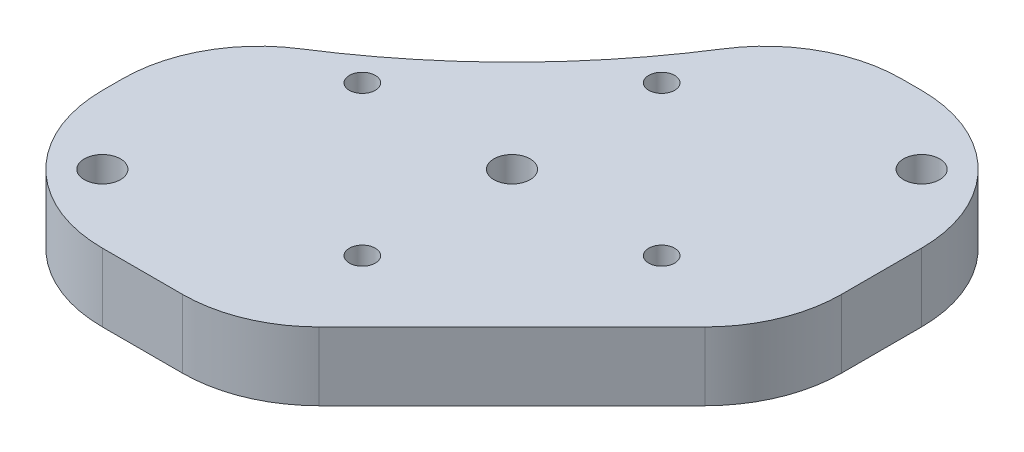
ISO-10303-21;
HEADER;
FILE_DESCRIPTION(('STEP AP214'),'2;1');
FILE_NAME('part.step','',(''),(''),'','','');
FILE_SCHEMA(('AUTOMOTIVE_DESIGN { 1 0 10303 214 1 1 1 1 }'));
ENDSEC;
DATA;
#1=APPLICATION_CONTEXT('core data for automotive mechanical design processes');
#2=APPLICATION_PROTOCOL_DEFINITION('international standard','automotive_design',2000,#1);
#3=PRODUCT_CONTEXT('',#1,'mechanical');
#4=PRODUCT('Part','Part','',(#3));
#5=PRODUCT_RELATED_PRODUCT_CATEGORY('part','',(#4));
#6=PRODUCT_DEFINITION_FORMATION('','',#4);
#7=PRODUCT_DEFINITION_CONTEXT('part definition',#1,'design');
#8=PRODUCT_DEFINITION('design','',#6,#7);
#9=PRODUCT_DEFINITION_SHAPE('','',#8);
#10=(LENGTH_UNIT() NAMED_UNIT(*) SI_UNIT(.MILLI.,.METRE.));
#11=(NAMED_UNIT(*) PLANE_ANGLE_UNIT() SI_UNIT($,.RADIAN.));
#12=(NAMED_UNIT(*) SI_UNIT($,.STERADIAN.) SOLID_ANGLE_UNIT());
#13=UNCERTAINTY_MEASURE_WITH_UNIT(LENGTH_MEASURE(1.E-05),#10,'distance_accuracy_value','');
#14=(GEOMETRIC_REPRESENTATION_CONTEXT(3) GLOBAL_UNCERTAINTY_ASSIGNED_CONTEXT((#13)) GLOBAL_UNIT_ASSIGNED_CONTEXT((#10,
#11,#12)) REPRESENTATION_CONTEXT('',''));
#15=CARTESIAN_POINT('',(0.,0.,0.));
#16=DIRECTION('',(0.,0.,1.));
#17=DIRECTION('',(1.,0.,0.));
#18=AXIS2_PLACEMENT_3D('',#15,#16,#17);
#19=CARTESIAN_POINT('',(105.000000000024,10.,105.000000000024));
#20=DIRECTION('',(-0.707106781186548,0.,-0.707106781186547));
#21=DIRECTION('',(-0.707106781186547,0.,0.707106781186548));
#22=AXIS2_PLACEMENT_3D('',#19,#20,#21);
#23=PLANE('',#22);
#24=DIRECTION('',(0.707106781186547,0.,-0.707106781186548));
#25=VECTOR('',#24,1.);
#26=CARTESIAN_POINT('',(105.000000000024,0.,105.000000000024));
#27=LINE('',#26,#25);
#28=CARTESIAN_POINT('',(90.8578643763174,0.,119.142135623731));
#29=VERTEX_POINT('',#28);
#30=CARTESIAN_POINT('',(119.142135623731,0.,90.8578643763174));
#31=VERTEX_POINT('',#30);
#32=EDGE_CURVE('E266',#29,#31,#27,.T.);
#33=ORIENTED_EDGE('',*,*,#32,.T.);
#34=DIRECTION('',(0.,-1.,0.));
#35=VECTOR('',#34,1.);
#36=CARTESIAN_POINT('',(119.142135623731,10.,90.8578643763174));
#37=LINE('',#36,#35);
#38=CARTESIAN_POINT('',(119.142135623731,10.,90.8578643763174));
#39=VERTEX_POINT('',#38);
#40=EDGE_CURVE('E229',#31,#39,#37,.F.);
#41=ORIENTED_EDGE('',*,*,#40,.T.);
#42=DIRECTION('',(0.707106781186547,0.,-0.707106781186548));
#43=VECTOR('',#42,1.);
#44=CARTESIAN_POINT('',(105.000000000024,10.,105.000000000024));
#45=LINE('',#44,#43);
#46=CARTESIAN_POINT('',(90.8578643763174,10.,119.142135623731));
#47=VERTEX_POINT('',#46);
#48=EDGE_CURVE('E310',#47,#39,#45,.T.);
#49=ORIENTED_EDGE('',*,*,#48,.F.);
#50=DIRECTION('',(0.,-1.,0.));
#51=VECTOR('',#50,1.);
#52=CARTESIAN_POINT('',(90.8578643763174,10.,119.142135623731));
#53=LINE('',#52,#51);
#54=EDGE_CURVE('E225',#47,#29,#53,.T.);
#55=ORIENTED_EDGE('',*,*,#54,.T.);
#56=EDGE_LOOP('',(#33,#41,#49,#55));
#57=FACE_BOUND('',#56,.T.);
#58=ADVANCED_FACE('F47',(#57),#23,.F.);
#59=CARTESIAN_POINT('',(125.,10.,0.));
#60=DIRECTION('',(-1.,0.,0.));
#61=DIRECTION('',(0.,0.,1.));
#62=AXIS2_PLACEMENT_3D('',#59,#60,#61);
#63=PLANE('',#62);
#64=DIRECTION('',(0.,0.,-1.));
#65=VECTOR('',#64,1.);
#66=CARTESIAN_POINT('',(125.,0.,0.));
#67=LINE('',#66,#65);
#68=CARTESIAN_POINT('',(125.,0.,76.7157287525864));
#69=VERTEX_POINT('',#68);
#70=CARTESIAN_POINT('',(125.,0.,65.));
#71=VERTEX_POINT('',#70);
#72=EDGE_CURVE('E270',#69,#71,#67,.T.);
#73=ORIENTED_EDGE('',*,*,#72,.T.);
#74=DIRECTION('',(0.,-1.,0.));
#75=VECTOR('',#74,1.);
#76=CARTESIAN_POINT('',(125.,10.,65.));
#77=LINE('',#76,#75);
#78=CARTESIAN_POINT('',(125.,10.,65.));
#79=VERTEX_POINT('',#78);
#80=EDGE_CURVE('E222',#71,#79,#77,.F.);
#81=ORIENTED_EDGE('',*,*,#80,.T.);
#82=DIRECTION('',(0.,0.,-1.));
#83=VECTOR('',#82,1.);
#84=CARTESIAN_POINT('',(125.,10.,0.));
#85=LINE('',#84,#83);
#86=CARTESIAN_POINT('',(125.,10.,76.7157287525864));
#87=VERTEX_POINT('',#86);
#88=EDGE_CURVE('E316',#87,#79,#85,.T.);
#89=ORIENTED_EDGE('',*,*,#88,.F.);
#90=DIRECTION('',(0.,-1.,0.));
#91=VECTOR('',#90,1.);
#92=CARTESIAN_POINT('',(125.,10.,76.7157287525864));
#93=LINE('',#92,#91);
#94=EDGE_CURVE('E218',#87,#69,#93,.T.);
#95=ORIENTED_EDGE('',*,*,#94,.T.);
#96=EDGE_LOOP('',(#73,#81,#89,#95));
#97=FACE_BOUND('',#96,.T.);
#98=ADVANCED_FACE('F349',(#97),#63,.F.);
#99=CARTESIAN_POINT('',(0.,10.,45.));
#100=DIRECTION('',(0.,0.,-1.));
#101=DIRECTION('',(-1.,0.,0.));
#102=AXIS2_PLACEMENT_3D('',#99,#100,#101);
#103=PLANE('',#102);
#104=DIRECTION('',(1.,0.,0.));
#105=VECTOR('',#104,1.);
#106=CARTESIAN_POINT('',(0.,0.,45.));
#107=LINE('',#106,#105);
#108=CARTESIAN_POINT('',(102.058806577385,0.,45.));
#109=VERTEX_POINT('',#108);
#110=CARTESIAN_POINT('',(105.,0.,45.));
#111=VERTEX_POINT('',#110);
#112=EDGE_CURVE('E274',#109,#111,#107,.T.);
#113=ORIENTED_EDGE('',*,*,#112,.F.);
#114=DIRECTION('',(0.,-1.,0.));
#115=VECTOR('',#114,1.);
#116=CARTESIAN_POINT('',(102.058806577385,10.,45.));
#117=LINE('',#116,#115);
#118=CARTESIAN_POINT('',(102.058806577385,10.,45.));
#119=VERTEX_POINT('',#118);
#120=EDGE_CURVE('E215',#109,#119,#117,.F.);
#121=ORIENTED_EDGE('',*,*,#120,.T.);
#122=DIRECTION('',(1.,0.,0.));
#123=VECTOR('',#122,1.);
#124=CARTESIAN_POINT('',(0.,10.,45.));
#125=LINE('',#124,#123);
#126=CARTESIAN_POINT('',(105.,10.,45.));
#127=VERTEX_POINT('',#126);
#128=EDGE_CURVE('E322',#119,#127,#125,.T.);
#129=ORIENTED_EDGE('',*,*,#128,.T.);
#130=DIRECTION('',(0.,-1.,0.));
#131=VECTOR('',#130,1.);
#132=CARTESIAN_POINT('',(105.,0.,45.));
#133=LINE('',#132,#131);
#134=EDGE_CURVE('E211',#127,#111,#133,.T.);
#135=ORIENTED_EDGE('',*,*,#134,.T.);
#136=EDGE_LOOP('',(#113,#121,#129,#135));
#137=FACE_BOUND('',#136,.T.);
#138=ADVANCED_FACE('F340',(#137),#103,.T.);
#139=CARTESIAN_POINT('',(0.,10.,0.));
#140=DIRECTION('',(0.,-1.,0.));
#141=DIRECTION('',(0.,0.,-1.));
#142=AXIS2_PLACEMENT_3D('',#139,#140,#141);
#143=CYLINDRICAL_SURFACE('',#142,101.);
#144=CARTESIAN_POINT('',(0.,0.,0.));
#145=DIRECTION('',(0.,1.,0.));
#146=DIRECTION('',(0.,0.,1.));
#147=AXIS2_PLACEMENT_3D('',#144,#145,#146);
#148=CIRCLE('',#147,101.);
#149=CARTESIAN_POINT('',(54.2561983471074,0.,85.1895823497177));
#150=VERTEX_POINT('',#149);
#151=CARTESIAN_POINT('',(85.1895823497177,0.,54.2561983471074));
#152=VERTEX_POINT('',#151);
#153=EDGE_CURVE('E158',#150,#152,#148,.T.);
#154=ORIENTED_EDGE('',*,*,#153,.F.);
#155=DIRECTION('',(0.,-1.,0.));
#156=VECTOR('',#155,1.);
#157=CARTESIAN_POINT('',(54.2561983471074,10.,85.1895823497177));
#158=LINE('',#157,#156);
#159=CARTESIAN_POINT('',(54.2561983471074,10.,85.1895823497177));
#160=VERTEX_POINT('',#159);
#161=EDGE_CURVE('E191',#150,#160,#158,.F.);
#162=ORIENTED_EDGE('',*,*,#161,.T.);
#163=CARTESIAN_POINT('',(0.,10.,0.));
#164=DIRECTION('',(0.,1.,0.));
#165=DIRECTION('',(0.,0.,1.));
#166=AXIS2_PLACEMENT_3D('',#163,#164,#165);
#167=CIRCLE('',#166,101.);
#168=CARTESIAN_POINT('',(85.1895823497177,10.,54.2561983471074));
#169=VERTEX_POINT('',#168);
#170=EDGE_CURVE('E244',#160,#169,#167,.T.);
#171=ORIENTED_EDGE('',*,*,#170,.T.);
#172=DIRECTION('',(0.,-1.,0.));
#173=VECTOR('',#172,1.);
#174=CARTESIAN_POINT('',(85.1895823497177,10.,54.2561983471074));
#175=LINE('',#174,#173);
#176=EDGE_CURVE('E187',#169,#152,#175,.T.);
#177=ORIENTED_EDGE('',*,*,#176,.T.);
#178=EDGE_LOOP('',(#154,#162,#171,#177));
#179=FACE_BOUND('',#178,.T.);
#180=ADVANCED_FACE('F331',(#179),#143,.F.);
#181=CARTESIAN_POINT('',(45.,10.,0.));
#182=DIRECTION('',(-1.,0.,0.));
#183=DIRECTION('',(0.,0.,1.));
#184=AXIS2_PLACEMENT_3D('',#181,#182,#183);
#185=PLANE('',#184);
#186=DIRECTION('',(0.,0.,-1.));
#187=VECTOR('',#186,1.);
#188=CARTESIAN_POINT('',(45.,10.,0.));
#189=LINE('',#188,#187);
#190=CARTESIAN_POINT('',(45.,10.,105.));
#191=VERTEX_POINT('',#190);
#192=CARTESIAN_POINT('',(45.,10.,102.058806577385));
#193=VERTEX_POINT('',#192);
#194=EDGE_CURVE('E237',#191,#193,#189,.T.);
#195=ORIENTED_EDGE('',*,*,#194,.T.);
#196=DIRECTION('',(0.,-1.,0.));
#197=VECTOR('',#196,1.);
#198=CARTESIAN_POINT('',(45.,10.,102.058806577385));
#199=LINE('',#198,#197);
#200=CARTESIAN_POINT('',(45.,0.,102.058806577385));
#201=VERTEX_POINT('',#200);
#202=EDGE_CURVE('E149',#193,#201,#199,.T.);
#203=ORIENTED_EDGE('',*,*,#202,.T.);
#204=DIRECTION('',(0.,0.,-1.));
#205=VECTOR('',#204,1.);
#206=CARTESIAN_POINT('',(45.,0.,0.));
#207=LINE('',#206,#205);
#208=CARTESIAN_POINT('',(45.,0.,105.));
#209=VERTEX_POINT('',#208);
#210=EDGE_CURVE('E141',#209,#201,#207,.T.);
#211=ORIENTED_EDGE('',*,*,#210,.F.);
#212=DIRECTION('',(0.,-1.,0.));
#213=VECTOR('',#212,1.);
#214=CARTESIAN_POINT('',(45.,10.,105.));
#215=LINE('',#214,#213);
#216=EDGE_CURVE('E155',#209,#191,#215,.F.);
#217=ORIENTED_EDGE('',*,*,#216,.T.);
#218=EDGE_LOOP('',(#195,#203,#211,#217));
#219=FACE_BOUND('',#218,.T.);
#220=ADVANCED_FACE('F154',(#219),#185,.T.);
#221=CARTESIAN_POINT('',(115.,10.,55.0000000000002));
#222=DIRECTION('',(0.,-1.,0.));
#223=DIRECTION('',(0.,0.,-1.));
#224=AXIS2_PLACEMENT_3D('',#221,#222,#223);
#225=CYLINDRICAL_SURFACE('',#224,2.65);
#226=CARTESIAN_POINT('',(115.,10.,55.0000000000002));
#227=DIRECTION('',(0.,1.,0.));
#228=DIRECTION('',(0.,0.,1.));
#229=AXIS2_PLACEMENT_3D('',#226,#227,#228);
#230=CIRCLE('',#229,2.65);
#231=CARTESIAN_POINT('',(115.,10.,57.6500000000002));
#232=VERTEX_POINT('',#231);
#233=EDGE_CURVE('E167',#232,#232,#230,.T.);
#234=ORIENTED_EDGE('',*,*,#233,.T.);
#235=EDGE_LOOP('',(#234));
#236=FACE_BOUND('',#235,.T.);
#237=CARTESIAN_POINT('',(115.,0.,55.0000000000002));
#238=DIRECTION('',(0.,1.,0.));
#239=DIRECTION('',(0.,0.,1.));
#240=AXIS2_PLACEMENT_3D('',#237,#238,#239);
#241=CIRCLE('',#240,2.65);
#242=CARTESIAN_POINT('',(115.,0.,57.6500000000002));
#243=VERTEX_POINT('',#242);
#244=EDGE_CURVE('E298',#243,#243,#241,.T.);
#245=ORIENTED_EDGE('',*,*,#244,.F.);
#246=EDGE_LOOP('',(#245));
#247=FACE_BOUND('',#246,.T.);
#248=ADVANCED_FACE('F475',(#236,#247),#225,.F.);
#249=CARTESIAN_POINT('',(63.0796897832173,10.,85.0000000000001));
#250=DIRECTION('',(0.,-1.,0.));
#251=DIRECTION('',(0.,0.,-1.));
#252=AXIS2_PLACEMENT_3D('',#249,#250,#251);
#253=CYLINDRICAL_SURFACE('',#252,1.90000000000001);
#254=CARTESIAN_POINT('',(63.0796897832173,10.,85.0000000000001));
#255=DIRECTION('',(0.,1.,0.));
#256=DIRECTION('',(0.,0.,1.));
#257=AXIS2_PLACEMENT_3D('',#254,#255,#256);
#258=CIRCLE('',#257,1.90000000000001);
#259=CARTESIAN_POINT('',(63.0796897832173,10.,86.9000000000001));
#260=VERTEX_POINT('',#259);
#261=EDGE_CURVE('E255',#260,#260,#258,.T.);
#262=ORIENTED_EDGE('',*,*,#261,.T.);
#263=EDGE_LOOP('',(#262));
#264=FACE_BOUND('',#263,.T.);
#265=CARTESIAN_POINT('',(63.0796897832173,0.,85.0000000000001));
#266=DIRECTION('',(0.,1.,0.));
#267=DIRECTION('',(0.,0.,1.));
#268=AXIS2_PLACEMENT_3D('',#265,#266,#267);
#269=CIRCLE('',#268,1.90000000000001);
#270=CARTESIAN_POINT('',(63.0796897832173,0.,86.9000000000001));
#271=VERTEX_POINT('',#270);
#272=EDGE_CURVE('E295',#271,#271,#269,.T.);
#273=ORIENTED_EDGE('',*,*,#272,.F.);
#274=EDGE_LOOP('',(#273));
#275=FACE_BOUND('',#274,.T.);
#276=ADVANCED_FACE('F513',(#264,#275),#253,.F.);
#277=CARTESIAN_POINT('',(85.,10.,63.079689783217));
#278=DIRECTION('',(0.,-1.,0.));
#279=DIRECTION('',(0.,0.,-1.));
#280=AXIS2_PLACEMENT_3D('',#277,#278,#279);
#281=CYLINDRICAL_SURFACE('',#280,1.9);
#282=CARTESIAN_POINT('',(85.,10.,63.079689783217));
#283=DIRECTION('',(0.,1.,0.));
#284=DIRECTION('',(0.,0.,1.));
#285=AXIS2_PLACEMENT_3D('',#282,#283,#284);
#286=CIRCLE('',#285,1.9);
#287=CARTESIAN_POINT('',(85.,10.,64.979689783217));
#288=VERTEX_POINT('',#287);
#289=EDGE_CURVE('E251',#288,#288,#286,.T.);
#290=ORIENTED_EDGE('',*,*,#289,.T.);
#291=EDGE_LOOP('',(#290));
#292=FACE_BOUND('',#291,.T.);
#293=CARTESIAN_POINT('',(85.,0.,63.079689783217));
#294=DIRECTION('',(0.,1.,0.));
#295=DIRECTION('',(0.,0.,1.));
#296=AXIS2_PLACEMENT_3D('',#293,#294,#295);
#297=CIRCLE('',#296,1.9);
#298=CARTESIAN_POINT('',(85.,0.,64.979689783217));
#299=VERTEX_POINT('',#298);
#300=EDGE_CURVE('E291',#299,#299,#297,.T.);
#301=ORIENTED_EDGE('',*,*,#300,.F.);
#302=EDGE_LOOP('',(#301));
#303=FACE_BOUND('',#302,.T.);
#304=ADVANCED_FACE('F521',(#292,#303),#281,.F.);
#305=CARTESIAN_POINT('',(85.0000000000005,10.,106.920310216783));
#306=DIRECTION('',(0.,-1.,0.));
#307=DIRECTION('',(0.,0.,-1.));
#308=AXIS2_PLACEMENT_3D('',#305,#306,#307);
#309=CYLINDRICAL_SURFACE('',#308,1.90000000000001);
#310=CARTESIAN_POINT('',(85.0000000000005,10.,106.920310216783));
#311=DIRECTION('',(0.,1.,0.));
#312=DIRECTION('',(0.,0.,1.));
#313=AXIS2_PLACEMENT_3D('',#310,#311,#312);
#314=CIRCLE('',#313,1.90000000000001);
#315=CARTESIAN_POINT('',(85.0000000000005,10.,108.820310216783));
#316=VERTEX_POINT('',#315);
#317=EDGE_CURVE('E242',#316,#316,#314,.T.);
#318=ORIENTED_EDGE('',*,*,#317,.T.);
#319=EDGE_LOOP('',(#318));
#320=FACE_BOUND('',#319,.T.);
#321=CARTESIAN_POINT('',(85.0000000000005,0.,106.920310216783));
#322=DIRECTION('',(0.,1.,0.));
#323=DIRECTION('',(0.,0.,1.));
#324=AXIS2_PLACEMENT_3D('',#321,#322,#323);
#325=CIRCLE('',#324,1.90000000000001);
#326=CARTESIAN_POINT('',(85.0000000000005,0.,108.820310216783));
#327=VERTEX_POINT('',#326);
#328=EDGE_CURVE('E287',#327,#327,#325,.T.);
#329=ORIENTED_EDGE('',*,*,#328,.F.);
#330=EDGE_LOOP('',(#329));
#331=FACE_BOUND('',#330,.T.);
#332=ADVANCED_FACE('F530',(#320,#331),#309,.F.);
#333=CARTESIAN_POINT('',(55.,10.,115.));
#334=DIRECTION('',(0.,-1.,0.));
#335=DIRECTION('',(0.,0.,-1.));
#336=AXIS2_PLACEMENT_3D('',#333,#334,#335);
#337=CYLINDRICAL_SURFACE('',#336,2.65);
#338=CARTESIAN_POINT('',(55.,10.,115.));
#339=DIRECTION('',(0.,1.,0.));
#340=DIRECTION('',(0.,0.,1.));
#341=AXIS2_PLACEMENT_3D('',#338,#339,#340);
#342=CIRCLE('',#341,2.65);
#343=CARTESIAN_POINT('',(55.,10.,117.65));
#344=VERTEX_POINT('',#343);
#345=EDGE_CURVE('E236',#344,#344,#342,.T.);
#346=ORIENTED_EDGE('',*,*,#345,.T.);
#347=EDGE_LOOP('',(#346));
#348=FACE_BOUND('',#347,.T.);
#349=CARTESIAN_POINT('',(55.,0.,115.));
#350=DIRECTION('',(0.,1.,0.));
#351=DIRECTION('',(0.,0.,1.));
#352=AXIS2_PLACEMENT_3D('',#349,#350,#351);
#353=CIRCLE('',#352,2.65);
#354=CARTESIAN_POINT('',(55.,0.,117.65));
#355=VERTEX_POINT('',#354);
#356=EDGE_CURVE('E283',#355,#355,#353,.T.);
#357=ORIENTED_EDGE('',*,*,#356,.F.);
#358=EDGE_LOOP('',(#357));
#359=FACE_BOUND('',#358,.T.);
#360=ADVANCED_FACE('F466',(#348,#359),#337,.F.);
#361=CARTESIAN_POINT('',(0.,10.,125.));
#362=DIRECTION('',(0.,0.,-1.));
#363=DIRECTION('',(-1.,0.,0.));
#364=AXIS2_PLACEMENT_3D('',#361,#362,#363);
#365=PLANE('',#364);
#366=DIRECTION('',(1.,0.,0.));
#367=VECTOR('',#366,1.);
#368=CARTESIAN_POINT('',(0.,0.,125.));
#369=LINE('',#368,#367);
#370=CARTESIAN_POINT('',(65.,0.,125.));
#371=VERTEX_POINT('',#370);
#372=CARTESIAN_POINT('',(76.7157287525865,0.,125.));
#373=VERTEX_POINT('',#372);
#374=EDGE_CURVE('E142',#371,#373,#369,.T.);
#375=ORIENTED_EDGE('',*,*,#374,.T.);
#376=DIRECTION('',(0.,-1.,0.));
#377=VECTOR('',#376,1.);
#378=CARTESIAN_POINT('',(76.7157287525865,10.,125.));
#379=LINE('',#378,#377);
#380=CARTESIAN_POINT('',(76.7157287525865,10.,125.));
#381=VERTEX_POINT('',#380);
#382=EDGE_CURVE('E11',#373,#381,#379,.F.);
#383=ORIENTED_EDGE('',*,*,#382,.T.);
#384=DIRECTION('',(1.,0.,0.));
#385=VECTOR('',#384,1.);
#386=CARTESIAN_POINT('',(0.,10.,125.));
#387=LINE('',#386,#385);
#388=CARTESIAN_POINT('',(65.,10.,125.));
#389=VERTEX_POINT('',#388);
#390=EDGE_CURVE('E233',#389,#381,#387,.T.);
#391=ORIENTED_EDGE('',*,*,#390,.F.);
#392=DIRECTION('',(0.,-1.,0.));
#393=VECTOR('',#392,1.);
#394=CARTESIAN_POINT('',(65.,0.,125.));
#395=LINE('',#394,#393);
#396=EDGE_CURVE('E56',#389,#371,#395,.T.);
#397=ORIENTED_EDGE('',*,*,#396,.T.);
#398=EDGE_LOOP('',(#375,#383,#391,#397));
#399=FACE_BOUND('',#398,.T.);
#400=ADVANCED_FACE('F232',(#399),#365,.F.);
#401=CARTESIAN_POINT('',(85.,10.,85.));
#402=DIRECTION('',(0.,-1.,0.));
#403=DIRECTION('',(0.,0.,-1.));
#404=AXIS2_PLACEMENT_3D('',#401,#402,#403);
#405=CYLINDRICAL_SURFACE('',#404,2.65);
#406=CARTESIAN_POINT('',(85.,10.,85.));
#407=DIRECTION('',(0.,1.,0.));
#408=DIRECTION('',(0.,0.,1.));
#409=AXIS2_PLACEMENT_3D('',#406,#407,#408);
#410=CIRCLE('',#409,2.65);
#411=CARTESIAN_POINT('',(85.,10.,87.65));
#412=VERTEX_POINT('',#411);
#413=EDGE_CURVE('E305',#412,#412,#410,.T.);
#414=ORIENTED_EDGE('',*,*,#413,.T.);
#415=EDGE_LOOP('',(#414));
#416=FACE_BOUND('',#415,.T.);
#417=CARTESIAN_POINT('',(85.,0.,85.));
#418=DIRECTION('',(0.,1.,0.));
#419=DIRECTION('',(0.,0.,1.));
#420=AXIS2_PLACEMENT_3D('',#417,#418,#419);
#421=CIRCLE('',#420,2.65);
#422=CARTESIAN_POINT('',(85.,0.,87.65));
#423=VERTEX_POINT('',#422);
#424=EDGE_CURVE('E262',#423,#423,#421,.T.);
#425=ORIENTED_EDGE('',*,*,#424,.F.);
#426=EDGE_LOOP('',(#425));
#427=FACE_BOUND('',#426,.T.);
#428=ADVANCED_FACE('F382',(#416,#427),#405,.F.);
#429=CARTESIAN_POINT('',(106.920310216783,10.,84.9999999999997));
#430=DIRECTION('',(0.,-1.,0.));
#431=DIRECTION('',(0.,0.,-1.));
#432=AXIS2_PLACEMENT_3D('',#429,#430,#431);
#433=CYLINDRICAL_SURFACE('',#432,1.9);
#434=CARTESIAN_POINT('',(106.920310216783,10.,84.9999999999997));
#435=DIRECTION('',(0.,1.,0.));
#436=DIRECTION('',(0.,0.,1.));
#437=AXIS2_PLACEMENT_3D('',#434,#435,#436);
#438=CIRCLE('',#437,1.9);
#439=CARTESIAN_POINT('',(106.920310216783,10.,86.8999999999997));
#440=VERTEX_POINT('',#439);
#441=EDGE_CURVE('E161',#440,#440,#438,.T.);
#442=ORIENTED_EDGE('',*,*,#441,.T.);
#443=EDGE_LOOP('',(#442));
#444=FACE_BOUND('',#443,.T.);
#445=CARTESIAN_POINT('',(106.920310216783,0.,84.9999999999997));
#446=DIRECTION('',(0.,1.,0.));
#447=DIRECTION('',(0.,0.,1.));
#448=AXIS2_PLACEMENT_3D('',#445,#446,#447);
#449=CIRCLE('',#448,1.9);
#450=CARTESIAN_POINT('',(106.920310216783,0.,86.8999999999997));
#451=VERTEX_POINT('',#450);
#452=EDGE_CURVE('E170',#451,#451,#449,.T.);
#453=ORIENTED_EDGE('',*,*,#452,.F.);
#454=EDGE_LOOP('',(#453));
#455=FACE_BOUND('',#454,.T.);
#456=ADVANCED_FACE('F365',(#444,#455),#433,.F.);
#457=CARTESIAN_POINT('',(0.,10.,0.));
#458=DIRECTION('',(0.,1.,0.));
#459=DIRECTION('',(0.,0.,1.));
#460=AXIS2_PLACEMENT_3D('',#457,#458,#459);
#461=PLANE('',#460);
#462=ORIENTED_EDGE('',*,*,#413,.F.);
#463=EDGE_LOOP('',(#462));
#464=FACE_BOUND('',#463,.T.);
#465=ORIENTED_EDGE('',*,*,#170,.F.);
#466=CARTESIAN_POINT('',(65.,10.,102.058806577385));
#467=DIRECTION('',(0.,1.,0.));
#468=DIRECTION('',(0.,0.,1.));
#469=AXIS2_PLACEMENT_3D('',#466,#467,#468);
#470=CIRCLE('',#469,20.);
#471=EDGE_CURVE('E208',#160,#193,#470,.T.);
#472=ORIENTED_EDGE('',*,*,#471,.T.);
#473=ORIENTED_EDGE('',*,*,#194,.F.);
#474=CARTESIAN_POINT('',(65.,10.,105.));
#475=DIRECTION('',(0.,1.,0.));
#476=DIRECTION('',(0.,0.,1.));
#477=AXIS2_PLACEMENT_3D('',#474,#475,#476);
#478=CIRCLE('',#477,20.);
#479=EDGE_CURVE('E68',#191,#389,#478,.T.);
#480=ORIENTED_EDGE('',*,*,#479,.T.);
#481=ORIENTED_EDGE('',*,*,#390,.T.);
#482=CARTESIAN_POINT('',(76.7157287525865,10.,105.));
#483=DIRECTION('',(0.,1.,0.));
#484=DIRECTION('',(0.,0.,1.));
#485=AXIS2_PLACEMENT_3D('',#482,#483,#484);
#486=CIRCLE('',#485,20.);
#487=EDGE_CURVE('E196',#381,#47,#486,.T.);
#488=ORIENTED_EDGE('',*,*,#487,.T.);
#489=ORIENTED_EDGE('',*,*,#48,.T.);
#490=CARTESIAN_POINT('',(105.,10.,76.7157287525864));
#491=DIRECTION('',(0.,1.,0.));
#492=DIRECTION('',(0.,0.,1.));
#493=AXIS2_PLACEMENT_3D('',#490,#491,#492);
#494=CIRCLE('',#493,20.);
#495=EDGE_CURVE('E199',#39,#87,#494,.T.);
#496=ORIENTED_EDGE('',*,*,#495,.T.);
#497=ORIENTED_EDGE('',*,*,#88,.T.);
#498=CARTESIAN_POINT('',(105.,10.,65.));
#499=DIRECTION('',(0.,1.,0.));
#500=DIRECTION('',(0.,0.,1.));
#501=AXIS2_PLACEMENT_3D('',#498,#499,#500);
#502=CIRCLE('',#501,20.);
#503=EDGE_CURVE('E202',#79,#127,#502,.T.);
#504=ORIENTED_EDGE('',*,*,#503,.T.);
#505=ORIENTED_EDGE('',*,*,#128,.F.);
#506=CARTESIAN_POINT('',(102.058806577385,10.,65.));
#507=DIRECTION('',(0.,1.,0.));
#508=DIRECTION('',(0.,0.,1.));
#509=AXIS2_PLACEMENT_3D('',#506,#507,#508);
#510=CIRCLE('',#509,20.);
#511=EDGE_CURVE('E205',#119,#169,#510,.T.);
#512=ORIENTED_EDGE('',*,*,#511,.T.);
#513=EDGE_LOOP('',(#465,#472,#473,#480,#481,#488,#489,#496,#497,#504,#505,#512));
#514=FACE_BOUND('',#513,.T.);
#515=ORIENTED_EDGE('',*,*,#345,.F.);
#516=EDGE_LOOP('',(#515));
#517=FACE_BOUND('',#516,.T.);
#518=ORIENTED_EDGE('',*,*,#317,.F.);
#519=EDGE_LOOP('',(#518));
#520=FACE_BOUND('',#519,.T.);
#521=ORIENTED_EDGE('',*,*,#289,.F.);
#522=EDGE_LOOP('',(#521));
#523=FACE_BOUND('',#522,.T.);
#524=ORIENTED_EDGE('',*,*,#261,.F.);
#525=EDGE_LOOP('',(#524));
#526=FACE_BOUND('',#525,.T.);
#527=ORIENTED_EDGE('',*,*,#233,.F.);
#528=EDGE_LOOP('',(#527));
#529=FACE_BOUND('',#528,.T.);
#530=ORIENTED_EDGE('',*,*,#441,.F.);
#531=EDGE_LOOP('',(#530));
#532=FACE_BOUND('',#531,.T.);
#533=ADVANCED_FACE('F362',(#464,#514,#517,#520,#523,#526,#529,#532),#461,.T.);
#534=CARTESIAN_POINT('',(0.,0.,0.));
#535=DIRECTION('',(0.,1.,0.));
#536=DIRECTION('',(0.,0.,1.));
#537=AXIS2_PLACEMENT_3D('',#534,#535,#536);
#538=PLANE('',#537);
#539=ORIENTED_EDGE('',*,*,#424,.T.);
#540=EDGE_LOOP('',(#539));
#541=FACE_BOUND('',#540,.T.);
#542=ORIENTED_EDGE('',*,*,#210,.T.);
#543=CARTESIAN_POINT('',(65.,0.,102.058806577385));
#544=DIRECTION('',(0.,1.,0.));
#545=DIRECTION('',(0.,0.,1.));
#546=AXIS2_PLACEMENT_3D('',#543,#544,#545);
#547=CIRCLE('',#546,20.);
#548=EDGE_CURVE('E184',#201,#150,#547,.F.);
#549=ORIENTED_EDGE('',*,*,#548,.T.);
#550=ORIENTED_EDGE('',*,*,#153,.T.);
#551=CARTESIAN_POINT('',(102.058806577385,0.,65.));
#552=DIRECTION('',(0.,1.,0.));
#553=DIRECTION('',(0.,0.,1.));
#554=AXIS2_PLACEMENT_3D('',#551,#552,#553);
#555=CIRCLE('',#554,20.);
#556=EDGE_CURVE('E181',#152,#109,#555,.F.);
#557=ORIENTED_EDGE('',*,*,#556,.T.);
#558=ORIENTED_EDGE('',*,*,#112,.T.);
#559=CARTESIAN_POINT('',(105.,0.,65.));
#560=DIRECTION('',(0.,1.,0.));
#561=DIRECTION('',(0.,0.,1.));
#562=AXIS2_PLACEMENT_3D('',#559,#560,#561);
#563=CIRCLE('',#562,20.);
#564=EDGE_CURVE('E178',#111,#71,#563,.F.);
#565=ORIENTED_EDGE('',*,*,#564,.T.);
#566=ORIENTED_EDGE('',*,*,#72,.F.);
#567=CARTESIAN_POINT('',(105.,0.,76.7157287525864));
#568=DIRECTION('',(0.,1.,0.));
#569=DIRECTION('',(0.,0.,1.));
#570=AXIS2_PLACEMENT_3D('',#567,#568,#569);
#571=CIRCLE('',#570,20.);
#572=EDGE_CURVE('E175',#69,#31,#571,.F.);
#573=ORIENTED_EDGE('',*,*,#572,.T.);
#574=ORIENTED_EDGE('',*,*,#32,.F.);
#575=CARTESIAN_POINT('',(76.7157287525865,0.,105.));
#576=DIRECTION('',(0.,1.,0.));
#577=DIRECTION('',(0.,0.,1.));
#578=AXIS2_PLACEMENT_3D('',#575,#576,#577);
#579=CIRCLE('',#578,20.);
#580=EDGE_CURVE('E148',#29,#373,#579,.F.);
#581=ORIENTED_EDGE('',*,*,#580,.T.);
#582=ORIENTED_EDGE('',*,*,#374,.F.);
#583=CARTESIAN_POINT('',(65.,0.,105.));
#584=DIRECTION('',(0.,1.,0.));
#585=DIRECTION('',(0.,0.,1.));
#586=AXIS2_PLACEMENT_3D('',#583,#584,#585);
#587=CIRCLE('',#586,20.);
#588=EDGE_CURVE('E137',#371,#209,#587,.F.);
#589=ORIENTED_EDGE('',*,*,#588,.T.);
#590=EDGE_LOOP('',(#542,#549,#550,#557,#558,#565,#566,#573,#574,#581,#582,#589));
#591=FACE_BOUND('',#590,.T.);
#592=ORIENTED_EDGE('',*,*,#356,.T.);
#593=EDGE_LOOP('',(#592));
#594=FACE_BOUND('',#593,.T.);
#595=ORIENTED_EDGE('',*,*,#328,.T.);
#596=EDGE_LOOP('',(#595));
#597=FACE_BOUND('',#596,.T.);
#598=ORIENTED_EDGE('',*,*,#300,.T.);
#599=EDGE_LOOP('',(#598));
#600=FACE_BOUND('',#599,.T.);
#601=ORIENTED_EDGE('',*,*,#272,.T.);
#602=EDGE_LOOP('',(#601));
#603=FACE_BOUND('',#602,.T.);
#604=ORIENTED_EDGE('',*,*,#244,.T.);
#605=EDGE_LOOP('',(#604));
#606=FACE_BOUND('',#605,.T.);
#607=ORIENTED_EDGE('',*,*,#452,.T.);
#608=EDGE_LOOP('',(#607));
#609=FACE_BOUND('',#608,.T.);
#610=ADVANCED_FACE('F139',(#541,#591,#594,#597,#600,#603,#606,#609),#538,.F.);
#611=CARTESIAN_POINT('',(65.,10.,102.058806577385));
#612=DIRECTION('',(0.,-1.,0.));
#613=DIRECTION('',(0.,0.,-1.));
#614=AXIS2_PLACEMENT_3D('',#611,#612,#613);
#615=CYLINDRICAL_SURFACE('',#614,20.);
#616=ORIENTED_EDGE('',*,*,#471,.F.);
#617=ORIENTED_EDGE('',*,*,#161,.F.);
#618=ORIENTED_EDGE('',*,*,#548,.F.);
#619=ORIENTED_EDGE('',*,*,#202,.F.);
#620=EDGE_LOOP('',(#616,#617,#618,#619));
#621=FACE_BOUND('',#620,.T.);
#622=ADVANCED_FACE('F398',(#621),#615,.T.);
#623=CARTESIAN_POINT('',(102.058806577385,10.,65.));
#624=DIRECTION('',(0.,-1.,0.));
#625=DIRECTION('',(0.,0.,-1.));
#626=AXIS2_PLACEMENT_3D('',#623,#624,#625);
#627=CYLINDRICAL_SURFACE('',#626,20.);
#628=ORIENTED_EDGE('',*,*,#511,.F.);
#629=ORIENTED_EDGE('',*,*,#120,.F.);
#630=ORIENTED_EDGE('',*,*,#556,.F.);
#631=ORIENTED_EDGE('',*,*,#176,.F.);
#632=EDGE_LOOP('',(#628,#629,#630,#631));
#633=FACE_BOUND('',#632,.T.);
#634=ADVANCED_FACE('F336',(#633),#627,.T.);
#635=CARTESIAN_POINT('',(105.,10.,65.));
#636=DIRECTION('',(0.,1.,0.));
#637=DIRECTION('',(0.,0.,1.));
#638=AXIS2_PLACEMENT_3D('',#635,#636,#637);
#639=CYLINDRICAL_SURFACE('',#638,20.);
#640=ORIENTED_EDGE('',*,*,#503,.F.);
#641=ORIENTED_EDGE('',*,*,#80,.F.);
#642=ORIENTED_EDGE('',*,*,#564,.F.);
#643=ORIENTED_EDGE('',*,*,#134,.F.);
#644=EDGE_LOOP('',(#640,#641,#642,#643));
#645=FACE_BOUND('',#644,.T.);
#646=ADVANCED_FACE('F345',(#645),#639,.T.);
#647=CARTESIAN_POINT('',(105.,10.,76.7157287525864));
#648=DIRECTION('',(0.,-1.,0.));
#649=DIRECTION('',(0.,0.,-1.));
#650=AXIS2_PLACEMENT_3D('',#647,#648,#649);
#651=CYLINDRICAL_SURFACE('',#650,20.);
#652=ORIENTED_EDGE('',*,*,#495,.F.);
#653=ORIENTED_EDGE('',*,*,#40,.F.);
#654=ORIENTED_EDGE('',*,*,#572,.F.);
#655=ORIENTED_EDGE('',*,*,#94,.F.);
#656=EDGE_LOOP('',(#652,#653,#654,#655));
#657=FACE_BOUND('',#656,.T.);
#658=ADVANCED_FACE('F354',(#657),#651,.T.);
#659=CARTESIAN_POINT('',(76.7157287525865,10.,105.));
#660=DIRECTION('',(0.,-1.,0.));
#661=DIRECTION('',(0.,0.,-1.));
#662=AXIS2_PLACEMENT_3D('',#659,#660,#661);
#663=CYLINDRICAL_SURFACE('',#662,20.);
#664=ORIENTED_EDGE('',*,*,#487,.F.);
#665=ORIENTED_EDGE('',*,*,#382,.F.);
#666=ORIENTED_EDGE('',*,*,#580,.F.);
#667=ORIENTED_EDGE('',*,*,#54,.F.);
#668=EDGE_LOOP('',(#664,#665,#666,#667));
#669=FACE_BOUND('',#668,.T.);
#670=ADVANCED_FACE('F361',(#669),#663,.T.);
#671=CARTESIAN_POINT('',(65.,10.,105.));
#672=DIRECTION('',(0.,1.,0.));
#673=DIRECTION('',(0.,0.,1.));
#674=AXIS2_PLACEMENT_3D('',#671,#672,#673);
#675=CYLINDRICAL_SURFACE('',#674,20.);
#676=ORIENTED_EDGE('',*,*,#479,.F.);
#677=ORIENTED_EDGE('',*,*,#216,.F.);
#678=ORIENTED_EDGE('',*,*,#588,.F.);
#679=ORIENTED_EDGE('',*,*,#396,.F.);
#680=EDGE_LOOP('',(#676,#677,#678,#679));
#681=FACE_BOUND('',#680,.T.);
#682=ADVANCED_FACE('F49',(#681),#675,.T.);
#683=CLOSED_SHELL('',(#58,#98,#138,#180,#220,#248,#276,#304,#332,#360,#400,#428,#456,#533,#610,
#622,#634,#646,#658,#670,#682));
#684=MANIFOLD_SOLID_BREP('B2',#683);
#685=ADVANCED_BREP_SHAPE_REPRESENTATION('',(#18,#684),#14);
#686=SHAPE_DEFINITION_REPRESENTATION(#9,#685);
ENDSEC;
END-ISO-10303-21;
